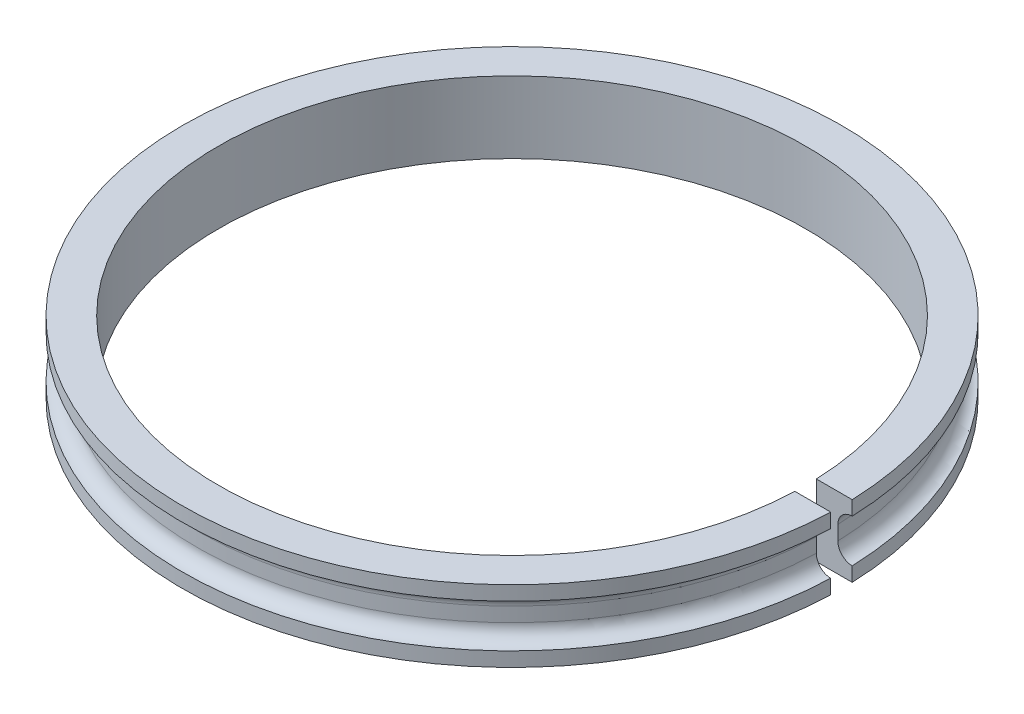
ISO-10303-21;
HEADER;
FILE_DESCRIPTION(('STEP AP214'),'2;1');
FILE_NAME('part.step','',(''),(''),'','','');
FILE_SCHEMA(('AUTOMOTIVE_DESIGN { 1 0 10303 214 1 1 1 1 }'));
ENDSEC;
DATA;
#1=APPLICATION_CONTEXT('core data for automotive mechanical design processes');
#2=APPLICATION_PROTOCOL_DEFINITION('international standard','automotive_design',2000,#1);
#3=PRODUCT_CONTEXT('',#1,'mechanical');
#4=PRODUCT('Part','Part','',(#3));
#5=PRODUCT_RELATED_PRODUCT_CATEGORY('part','',(#4));
#6=PRODUCT_DEFINITION_FORMATION('','',#4);
#7=PRODUCT_DEFINITION_CONTEXT('part definition',#1,'design');
#8=PRODUCT_DEFINITION('design','',#6,#7);
#9=PRODUCT_DEFINITION_SHAPE('','',#8);
#10=(LENGTH_UNIT() NAMED_UNIT(*) SI_UNIT(.MILLI.,.METRE.));
#11=(NAMED_UNIT(*) PLANE_ANGLE_UNIT() SI_UNIT($,.RADIAN.));
#12=(NAMED_UNIT(*) SI_UNIT($,.STERADIAN.) SOLID_ANGLE_UNIT());
#13=UNCERTAINTY_MEASURE_WITH_UNIT(LENGTH_MEASURE(1.E-05),#10,'distance_accuracy_value','');
#14=(GEOMETRIC_REPRESENTATION_CONTEXT(3) GLOBAL_UNCERTAINTY_ASSIGNED_CONTEXT((#13)) GLOBAL_UNIT_ASSIGNED_CONTEXT((#10,
#11,#12)) REPRESENTATION_CONTEXT('',''));
#15=CARTESIAN_POINT('',(0.,0.,0.));
#16=DIRECTION('',(0.,0.,1.));
#17=DIRECTION('',(1.,0.,0.));
#18=AXIS2_PLACEMENT_3D('',#15,#16,#17);
#19=CARTESIAN_POINT('',(-93.,4.,0.));
#20=DIRECTION('',(0.,-1.,0.));
#21=DIRECTION('',(0.,0.,-1.));
#22=AXIS2_PLACEMENT_3D('',#19,#20,#21);
#23=TOROIDAL_SURFACE('',#22,46.,2.);
#24=CARTESIAN_POINT('',(-93.,4.,0.));
#25=DIRECTION('',(0.,-1.,0.));
#26=DIRECTION('',(0.,0.,-1.));
#27=AXIS2_PLACEMENT_3D('',#24,#25,#26);
#28=CIRCLE('',#27,44.);
#29=CARTESIAN_POINT('',(-49.02557561491,4.,-1.5));
#30=VERTEX_POINT('',#29);
#31=CARTESIAN_POINT('',(-49.02557561491,4.,1.5));
#32=VERTEX_POINT('',#31);
#33=EDGE_CURVE('E99',#30,#32,#28,.F.);
#34=ORIENTED_EDGE('',*,*,#33,.F.);
#35=CARTESIAN_POINT('',(-49.02557561491,4.,-1.5));
#36=CARTESIAN_POINT('',(-49.0255752617127,3.9437526593681,-1.5));
#37=CARTESIAN_POINT('',(-49.0231999225664,3.88753227299927,-1.5));
#38=CARTESIAN_POINT('',(-49.0137238553494,3.77549401706613,-1.5));
#39=CARTESIAN_POINT('',(-49.0066233600378,3.71967612781189,-1.5));
#40=CARTESIAN_POINT('',(-48.9783030133706,3.55353055209689,-1.5));
#41=CARTESIAN_POINT('',(-48.9500641050258,3.44431603928843,-1.5));
#42=CARTESIAN_POINT('',(-48.8756541575683,3.23218215289164,-1.5));
#43=CARTESIAN_POINT('',(-48.8294747304092,3.12926575006156,-1.5));
#44=CARTESIAN_POINT('',(-48.720499819323,2.93264026134801,-1.5));
#45=CARTESIAN_POINT('',(-48.6577062064194,2.83893014031819,-1.5));
#46=CARTESIAN_POINT('',(-48.517264034677,2.66335009598695,-1.5));
#47=CARTESIAN_POINT('',(-48.4396106910103,2.58148400140877,-1.5));
#48=CARTESIAN_POINT('',(-48.2716695952436,2.43194079901288,-1.5));
#49=CARTESIAN_POINT('',(-48.1813818129104,2.36426372514936,-1.5));
#50=CARTESIAN_POINT('',(-47.990682603861,2.24498564534979,-1.5));
#51=CARTESIAN_POINT('',(-47.8902662781117,2.1933924687982,-1.5));
#52=CARTESIAN_POINT('',(-47.6822036521515,2.10778017983119,-1.5));
#53=CARTESIAN_POINT('',(-47.5745564793652,2.07376319272592,-1.5));
#54=CARTESIAN_POINT('',(-47.3550213612993,2.02427767687998,-1.5));
#55=CARTESIAN_POINT('',(-47.2431333830546,2.00880929235399,-1.5));
#56=CARTESIAN_POINT('',(-47.0746133491114,1.99983309304084,-1.5));
#57=CARTESIAN_POINT('',(-47.0182775601828,1.99921758557036,-1.5));
#58=CARTESIAN_POINT('',(-46.9057513613097,2.00273073005957,-1.5));
#59=CARTESIAN_POINT('',(-46.8495609583746,2.00685960663644,-1.5));
#60=CARTESIAN_POINT('',(-46.7936178312496,2.01335285538699,-1.5));
#61=B_SPLINE_CURVE_WITH_KNOTS('',3,(#35,#36,#37,#38,#39,#40,#41,#42,#43,#44,#45,#46,#47,#48,#49,
#50,#51,#52,#53,#54,#55,#56,#57,#58,#59,#60),.UNSPECIFIED.,.F.,.F.,(4,2,2,2,2,2,2,2,2,2,2,2,4),
(0.,0.168638346672592,0.337268386911073,0.67395115708494,1.01079153229287,1.34759399000942,
1.68450508103828,2.02141697828313,2.35849262369325,2.69560901870575,3.03272803476837,
3.20157236250897,3.37042468431165),.UNSPECIFIED.);
#62=CARTESIAN_POINT('',(-47.0244630265182,2.,-1.5));
#63=VERTEX_POINT('',#62);
#64=EDGE_CURVE('E45',#30,#63,#61,.T.);
#65=ORIENTED_EDGE('',*,*,#64,.T.);
#66=CARTESIAN_POINT('',(-93.,2.,0.));
#67=DIRECTION('',(0.,-1.,0.));
#68=DIRECTION('',(0.,0.,-1.));
#69=AXIS2_PLACEMENT_3D('',#66,#67,#68);
#70=CIRCLE('',#69,46.);
#71=CARTESIAN_POINT('',(-47.0244630265182,2.,1.5));
#72=VERTEX_POINT('',#71);
#73=EDGE_CURVE('E97',#72,#63,#70,.T.);
#74=ORIENTED_EDGE('',*,*,#73,.F.);
#75=CARTESIAN_POINT('',(-49.02557561491,4.,1.5));
#76=CARTESIAN_POINT('',(-49.0255752617127,3.9437526593681,1.5));
#77=CARTESIAN_POINT('',(-49.0231999225664,3.88753227299927,1.5));
#78=CARTESIAN_POINT('',(-49.0137238553494,3.77549401706613,1.5));
#79=CARTESIAN_POINT('',(-49.0066233600378,3.71967612781189,1.5));
#80=CARTESIAN_POINT('',(-48.9783030133706,3.55353055209689,1.5));
#81=CARTESIAN_POINT('',(-48.9500641050258,3.44431603928843,1.5));
#82=CARTESIAN_POINT('',(-48.8756541575683,3.23218215289164,1.5));
#83=CARTESIAN_POINT('',(-48.8294747304092,3.12926575006156,1.5));
#84=CARTESIAN_POINT('',(-48.720499819323,2.93264026134801,1.5));
#85=CARTESIAN_POINT('',(-48.6577062064194,2.83893014031819,1.5));
#86=CARTESIAN_POINT('',(-48.517264034677,2.66335009598695,1.5));
#87=CARTESIAN_POINT('',(-48.4396106910103,2.58148400140877,1.5));
#88=CARTESIAN_POINT('',(-48.2716695952436,2.43194079901288,1.5));
#89=CARTESIAN_POINT('',(-48.1813818129104,2.36426372514936,1.5));
#90=CARTESIAN_POINT('',(-47.990682603861,2.24498564534979,1.5));
#91=CARTESIAN_POINT('',(-47.8902662781117,2.1933924687982,1.5));
#92=CARTESIAN_POINT('',(-47.6822036521515,2.10778017983119,1.5));
#93=CARTESIAN_POINT('',(-47.5745564793652,2.07376319272592,1.5));
#94=CARTESIAN_POINT('',(-47.3550213612993,2.02427767687998,1.5));
#95=CARTESIAN_POINT('',(-47.2431333830546,2.00880929235399,1.5));
#96=CARTESIAN_POINT('',(-47.0746133491114,1.99983309304084,1.5));
#97=CARTESIAN_POINT('',(-47.0182775601828,1.99921758557036,1.5));
#98=CARTESIAN_POINT('',(-46.9057513613097,2.00273073005957,1.5));
#99=CARTESIAN_POINT('',(-46.8495609583746,2.00685960663644,1.5));
#100=CARTESIAN_POINT('',(-46.7936178312496,2.01335285538699,1.5));
#101=B_SPLINE_CURVE_WITH_KNOTS('',3,(#75,#76,#77,#78,#79,#80,#81,#82,#83,#84,#85,#86,#87,#88,
#89,#90,#91,#92,#93,#94,#95,#96,#97,#98,#99,#100),.UNSPECIFIED.,.F.,.F.,(4,2,2,2,2,2,2,2,2,2,2,
2,4),(0.,0.168638346672592,0.337268386911073,0.67395115708494,1.01079153229287,1.34759399000942,
1.68450508103828,2.02141697828313,2.35849262369325,2.69560901870575,3.03272803476837,
3.20157236250897,3.37042468431165),.UNSPECIFIED.);
#102=EDGE_CURVE('E11',#72,#32,#101,.F.);
#103=ORIENTED_EDGE('',*,*,#102,.T.);
#104=EDGE_LOOP('',(#34,#65,#74,#103));
#105=FACE_BOUND('',#104,.T.);
#106=ADVANCED_FACE('F33',(#105),#23,.F.);
#107=CARTESIAN_POINT('',(-93.,6.,0.));
#108=DIRECTION('',(0.,-1.,0.));
#109=DIRECTION('',(0.,0.,-1.));
#110=AXIS2_PLACEMENT_3D('',#107,#108,#109);
#111=TOROIDAL_SURFACE('',#110,46.,2.);
#112=CARTESIAN_POINT('',(-93.,8.,0.));
#113=DIRECTION('',(0.,-1.,0.));
#114=DIRECTION('',(0.,0.,-1.));
#115=AXIS2_PLACEMENT_3D('',#112,#113,#114);
#116=CIRCLE('',#115,46.);
#117=CARTESIAN_POINT('',(-47.0244630265182,8.,1.5));
#118=VERTEX_POINT('',#117);
#119=CARTESIAN_POINT('',(-47.0244630265182,8.,-1.5));
#120=VERTEX_POINT('',#119);
#121=EDGE_CURVE('E108',#118,#120,#116,.T.);
#122=ORIENTED_EDGE('',*,*,#121,.T.);
#123=CARTESIAN_POINT('',(-49.02557561491,6.,-1.5));
#124=CARTESIAN_POINT('',(-49.0255752617127,6.0562473406319,-1.5));
#125=CARTESIAN_POINT('',(-49.0231999225664,6.11246772700074,-1.5));
#126=CARTESIAN_POINT('',(-49.0137238553494,6.22450598293387,-1.5));
#127=CARTESIAN_POINT('',(-49.0066233600378,6.28032387218811,-1.5));
#128=CARTESIAN_POINT('',(-48.9783030133706,6.44646944790311,-1.5));
#129=CARTESIAN_POINT('',(-48.9500641050258,6.55568396071157,-1.5));
#130=CARTESIAN_POINT('',(-48.8756541575683,6.76781784710836,-1.5));
#131=CARTESIAN_POINT('',(-48.8294747304092,6.87073424993844,-1.5));
#132=CARTESIAN_POINT('',(-48.720499819323,7.06735973865199,-1.5));
#133=CARTESIAN_POINT('',(-48.6577062064194,7.16106985968181,-1.5));
#134=CARTESIAN_POINT('',(-48.517264034677,7.33664990401305,-1.5));
#135=CARTESIAN_POINT('',(-48.4396106910103,7.41851599859123,-1.5));
#136=CARTESIAN_POINT('',(-48.2716695952436,7.56805920098712,-1.5));
#137=CARTESIAN_POINT('',(-48.1813818129104,7.63573627485064,-1.5));
#138=CARTESIAN_POINT('',(-47.990682603861,7.75501435465021,-1.5));
#139=CARTESIAN_POINT('',(-47.8902662781117,7.8066075312018,-1.5));
#140=CARTESIAN_POINT('',(-47.6822036521515,7.89221982016881,-1.5));
#141=CARTESIAN_POINT('',(-47.5745564793652,7.92623680727408,-1.5));
#142=CARTESIAN_POINT('',(-47.3550213612993,7.97572232312002,-1.5));
#143=CARTESIAN_POINT('',(-47.2431333830546,7.99119070764601,-1.5));
#144=CARTESIAN_POINT('',(-47.0746133491114,8.00016690695917,-1.5));
#145=CARTESIAN_POINT('',(-47.0182775601828,8.00078241442964,-1.5));
#146=CARTESIAN_POINT('',(-46.9057513613097,7.99726926994043,-1.5));
#147=CARTESIAN_POINT('',(-46.8495609583746,7.99314039336356,-1.5));
#148=CARTESIAN_POINT('',(-46.7936178312496,7.98664714461301,-1.5));
#149=B_SPLINE_CURVE_WITH_KNOTS('',3,(#123,#124,#125,#126,#127,#128,#129,#130,#131,#132,#133,
#134,#135,#136,#137,#138,#139,#140,#141,#142,#143,#144,#145,#146,#147,#148),.UNSPECIFIED.,.F.,
.F.,(4,2,2,2,2,2,2,2,2,2,2,2,4),(0.,0.168638346672593,0.337268386911073,0.67395115708494,
1.01079153229287,1.34759399000941,1.68450508103828,2.02141697828313,2.35849262369325,
2.69560901870575,3.03272803476837,3.20157236250897,3.37042468431165),.UNSPECIFIED.);
#150=CARTESIAN_POINT('',(-49.02557561491,6.,-1.5));
#151=VERTEX_POINT('',#150);
#152=EDGE_CURVE('E142',#120,#151,#149,.F.);
#153=ORIENTED_EDGE('',*,*,#152,.T.);
#154=CARTESIAN_POINT('',(-93.,6.,0.));
#155=DIRECTION('',(0.,-1.,0.));
#156=DIRECTION('',(0.,0.,-1.));
#157=AXIS2_PLACEMENT_3D('',#154,#155,#156);
#158=CIRCLE('',#157,44.);
#159=CARTESIAN_POINT('',(-49.02557561491,6.,1.5));
#160=VERTEX_POINT('',#159);
#161=EDGE_CURVE('E139',#160,#151,#158,.T.);
#162=ORIENTED_EDGE('',*,*,#161,.F.);
#163=CARTESIAN_POINT('',(-47.0244630265182,8.,1.5));
#164=CARTESIAN_POINT('',(-47.0807873093381,7.99999961250028,1.5));
#165=CARTESIAN_POINT('',(-47.1370846127367,7.99762172312208,1.5));
#166=CARTESIAN_POINT('',(-47.249276480401,7.98813530808788,1.5));
#167=CARTESIAN_POINT('',(-47.3051710635456,7.98102700566522,1.5));
#168=CARTESIAN_POINT('',(-47.4715489020133,7.95267450445812,1.5));
#169=CARTESIAN_POINT('',(-47.5809179635325,7.92440252071446,1.5));
#170=CARTESIAN_POINT('',(-47.793354057642,7.84989915621452,1.5));
#171=CARTESIAN_POINT('',(-47.8964180512628,7.80365919281775,1.5));
#172=CARTESIAN_POINT('',(-48.0933207906504,7.6945313795319,1.5));
#173=CARTESIAN_POINT('',(-48.1871606463517,7.63164553600189,1.5));
#174=CARTESIAN_POINT('',(-48.3629272878691,7.49101791229881,1.5));
#175=CARTESIAN_POINT('',(-48.444855975276,7.41327850805898,1.5));
#176=CARTESIAN_POINT('',(-48.594492055469,7.24514294427632,1.5));
#177=CARTESIAN_POINT('',(-48.6621994813467,7.15474681418537,1.5));
#178=CARTESIAN_POINT('',(-48.7814279666101,6.96391442222868,1.5));
#179=CARTESIAN_POINT('',(-48.832958371446,6.86348400153718,1.5));
#180=CARTESIAN_POINT('',(-48.9184242077933,6.65539809307321,1.5));
#181=CARTESIAN_POINT('',(-48.9523576606363,6.54774179433194,1.5));
#182=CARTESIAN_POINT('',(-49.0016250843505,6.32830947506348,1.5));
#183=CARTESIAN_POINT('',(-49.0169775597432,6.21653766763981,1.5));
#184=CARTESIAN_POINT('',(-49.0257888564736,6.04820427198995,1.5));
#185=CARTESIAN_POINT('',(-49.0263507849234,5.99193227214987,1.5));
#186=CARTESIAN_POINT('',(-49.0227337242559,5.87953801074739,1.5));
#187=CARTESIAN_POINT('',(-49.0185545024,5.82341575667144,1.5));
#188=CARTESIAN_POINT('',(-49.0120127353524,5.76754300287763,1.5));
#189=B_SPLINE_CURVE_WITH_KNOTS('',3,(#163,#164,#165,#166,#167,#168,#169,#170,#171,#172,#173,
#174,#175,#176,#177,#178,#179,#180,#181,#182,#183,#184,#185,#186,#187,#188),.UNSPECIFIED.,.F.,
.F.,(4,2,2,2,2,2,2,2,2,2,2,2,4),(0.,0.168869077454674,0.337730186359345,0.674884571641019,
1.01220020148368,1.34947519254124,1.68669627914934,2.0239165810655,2.36094171109226,
2.69800472929741,3.03473179446849,3.2033830818738,3.37204264856947),.UNSPECIFIED.);
#190=EDGE_CURVE('E149',#160,#118,#189,.F.);
#191=ORIENTED_EDGE('',*,*,#190,.T.);
#192=EDGE_LOOP('',(#122,#153,#162,#191));
#193=FACE_BOUND('',#192,.T.);
#194=ADVANCED_FACE('F154',(#193),#111,.F.);
#195=CARTESIAN_POINT('',(-93.,10.,0.));
#196=DIRECTION('',(0.,-1.,0.));
#197=DIRECTION('',(0.,0.,-1.));
#198=AXIS2_PLACEMENT_3D('',#195,#196,#197);
#199=CYLINDRICAL_SURFACE('',#198,46.);
#200=ORIENTED_EDGE('',*,*,#121,.F.);
#201=DIRECTION('',(0.,-1.,0.));
#202=VECTOR('',#201,1.);
#203=CARTESIAN_POINT('',(-47.0244630265182,10.,1.5));
#204=LINE('',#203,#202);
#205=CARTESIAN_POINT('',(-47.0244630265182,10.,1.5));
#206=VERTEX_POINT('',#205);
#207=EDGE_CURVE('E120',#206,#118,#204,.T.);
#208=ORIENTED_EDGE('',*,*,#207,.F.);
#209=CARTESIAN_POINT('',(-93.,10.,0.));
#210=DIRECTION('',(0.,1.,0.));
#211=DIRECTION('',(0.,0.,1.));
#212=AXIS2_PLACEMENT_3D('',#209,#210,#211);
#213=CIRCLE('',#212,46.);
#214=CARTESIAN_POINT('',(-47.0244630265182,10.,-1.5));
#215=VERTEX_POINT('',#214);
#216=EDGE_CURVE('E127',#215,#206,#213,.T.);
#217=ORIENTED_EDGE('',*,*,#216,.F.);
#218=DIRECTION('',(0.,-1.,0.));
#219=VECTOR('',#218,1.);
#220=CARTESIAN_POINT('',(-47.0244630265182,10.,-1.5));
#221=LINE('',#220,#219);
#222=EDGE_CURVE('E115',#120,#215,#221,.F.);
#223=ORIENTED_EDGE('',*,*,#222,.F.);
#224=EDGE_LOOP('',(#200,#208,#217,#223));
#225=FACE_BOUND('',#224,.T.);
#226=ADVANCED_FACE('F182',(#225),#199,.T.);
#227=CARTESIAN_POINT('',(-57.8530362581809,10.,1.5));
#228=DIRECTION('',(0.,0.,-1.));
#229=DIRECTION('',(-1.,0.,0.));
#230=AXIS2_PLACEMENT_3D('',#227,#228,#229);
#231=PLANE('',#230);
#232=ORIENTED_EDGE('',*,*,#190,.F.);
#233=DIRECTION('',(0.,-1.,0.));
#234=VECTOR('',#233,1.);
#235=CARTESIAN_POINT('',(-49.02557561491,8.,1.5));
#236=LINE('',#235,#234);
#237=EDGE_CURVE('E109',#160,#32,#236,.T.);
#238=ORIENTED_EDGE('',*,*,#237,.T.);
#239=ORIENTED_EDGE('',*,*,#102,.F.);
#240=CARTESIAN_POINT('',(-47.0244630265182,0.,1.5));
#241=VERTEX_POINT('',#240);
#242=EDGE_CURVE('E107',#72,#241,#204,.T.);
#243=ORIENTED_EDGE('',*,*,#242,.T.);
#244=DIRECTION('',(1.,0.,0.));
#245=VECTOR('',#244,1.);
#246=CARTESIAN_POINT('',(-57.8530362581809,0.,1.5));
#247=LINE('',#246,#245);
#248=CARTESIAN_POINT('',(-52.0274482122483,0.,1.5));
#249=VERTEX_POINT('',#248);
#250=EDGE_CURVE('E190',#249,#241,#247,.T.);
#251=ORIENTED_EDGE('',*,*,#250,.F.);
#252=DIRECTION('',(0.,-1.,0.));
#253=VECTOR('',#252,1.);
#254=CARTESIAN_POINT('',(-52.0274482122483,10.,1.5));
#255=LINE('',#254,#253);
#256=CARTESIAN_POINT('',(-52.0274482122483,10.,1.5));
#257=VERTEX_POINT('',#256);
#258=EDGE_CURVE('E130',#257,#249,#255,.T.);
#259=ORIENTED_EDGE('',*,*,#258,.F.);
#260=DIRECTION('',(1.,0.,0.));
#261=VECTOR('',#260,1.);
#262=CARTESIAN_POINT('',(-57.8530362581809,10.,1.5));
#263=LINE('',#262,#261);
#264=EDGE_CURVE('E186',#257,#206,#263,.T.);
#265=ORIENTED_EDGE('',*,*,#264,.T.);
#266=ORIENTED_EDGE('',*,*,#207,.T.);
#267=EDGE_LOOP('',(#232,#238,#239,#243,#251,#259,#265,#266));
#268=FACE_BOUND('',#267,.T.);
#269=ADVANCED_FACE('F161',(#268),#231,.T.);
#270=CARTESIAN_POINT('',(-57.8530362581809,10.,-1.5));
#271=DIRECTION('',(0.,0.,1.));
#272=DIRECTION('',(1.,0.,0.));
#273=AXIS2_PLACEMENT_3D('',#270,#271,#272);
#274=PLANE('',#273);
#275=ORIENTED_EDGE('',*,*,#64,.F.);
#276=DIRECTION('',(0.,-1.,0.));
#277=VECTOR('',#276,1.);
#278=CARTESIAN_POINT('',(-49.02557561491,8.,-1.5));
#279=LINE('',#278,#277);
#280=EDGE_CURVE('E137',#30,#151,#279,.F.);
#281=ORIENTED_EDGE('',*,*,#280,.T.);
#282=ORIENTED_EDGE('',*,*,#152,.F.);
#283=ORIENTED_EDGE('',*,*,#222,.T.);
#284=DIRECTION('',(-1.,0.,0.));
#285=VECTOR('',#284,1.);
#286=CARTESIAN_POINT('',(-57.8530362581809,10.,-1.5));
#287=LINE('',#286,#285);
#288=CARTESIAN_POINT('',(-52.0274482122483,10.,-1.5));
#289=VERTEX_POINT('',#288);
#290=EDGE_CURVE('E188',#215,#289,#287,.T.);
#291=ORIENTED_EDGE('',*,*,#290,.T.);
#292=DIRECTION('',(0.,-1.,0.));
#293=VECTOR('',#292,1.);
#294=CARTESIAN_POINT('',(-52.0274482122483,10.,-1.5));
#295=LINE('',#294,#293);
#296=CARTESIAN_POINT('',(-52.0274482122483,0.,-1.5));
#297=VERTEX_POINT('',#296);
#298=EDGE_CURVE('E134',#297,#289,#295,.F.);
#299=ORIENTED_EDGE('',*,*,#298,.F.);
#300=DIRECTION('',(-1.,0.,0.));
#301=VECTOR('',#300,1.);
#302=CARTESIAN_POINT('',(-57.8530362581809,0.,-1.5));
#303=LINE('',#302,#301);
#304=CARTESIAN_POINT('',(-47.0244630265182,0.,-1.5));
#305=VERTEX_POINT('',#304);
#306=EDGE_CURVE('E113',#305,#297,#303,.T.);
#307=ORIENTED_EDGE('',*,*,#306,.F.);
#308=EDGE_CURVE('E105',#305,#63,#221,.F.);
#309=ORIENTED_EDGE('',*,*,#308,.T.);
#310=EDGE_LOOP('',(#275,#281,#282,#283,#291,#299,#307,#309));
#311=FACE_BOUND('',#310,.T.);
#312=ADVANCED_FACE('F111',(#311),#274,.T.);
#313=CARTESIAN_POINT('',(-93.,10.,0.));
#314=DIRECTION('',(0.,1.,0.));
#315=DIRECTION('',(0.,0.,1.));
#316=AXIS2_PLACEMENT_3D('',#313,#314,#315);
#317=PLANE('',#316);
#318=CARTESIAN_POINT('',(-93.,10.,0.));
#319=DIRECTION('',(0.,1.,0.));
#320=DIRECTION('',(0.,0.,1.));
#321=AXIS2_PLACEMENT_3D('',#318,#319,#320);
#322=CIRCLE('',#321,41.);
#323=EDGE_CURVE('E118',#289,#257,#322,.T.);
#324=ORIENTED_EDGE('',*,*,#323,.F.);
#325=ORIENTED_EDGE('',*,*,#290,.F.);
#326=ORIENTED_EDGE('',*,*,#216,.T.);
#327=ORIENTED_EDGE('',*,*,#264,.F.);
#328=EDGE_LOOP('',(#324,#325,#326,#327));
#329=FACE_BOUND('',#328,.T.);
#330=ADVANCED_FACE('F160',(#329),#317,.T.);
#331=CARTESIAN_POINT('',(-93.,0.,0.));
#332=DIRECTION('',(0.,1.,0.));
#333=DIRECTION('',(0.,0.,1.));
#334=AXIS2_PLACEMENT_3D('',#331,#332,#333);
#335=PLANE('',#334);
#336=ORIENTED_EDGE('',*,*,#306,.T.);
#337=CARTESIAN_POINT('',(-93.,0.,0.));
#338=DIRECTION('',(0.,1.,0.));
#339=DIRECTION('',(0.,0.,1.));
#340=AXIS2_PLACEMENT_3D('',#337,#338,#339);
#341=CIRCLE('',#340,41.);
#342=EDGE_CURVE('E114',#297,#249,#341,.T.);
#343=ORIENTED_EDGE('',*,*,#342,.T.);
#344=ORIENTED_EDGE('',*,*,#250,.T.);
#345=CARTESIAN_POINT('',(-93.,0.,0.));
#346=DIRECTION('',(0.,1.,0.));
#347=DIRECTION('',(0.,0.,1.));
#348=AXIS2_PLACEMENT_3D('',#345,#346,#347);
#349=CIRCLE('',#348,46.);
#350=EDGE_CURVE('E125',#305,#241,#349,.T.);
#351=ORIENTED_EDGE('',*,*,#350,.F.);
#352=EDGE_LOOP('',(#336,#343,#344,#351));
#353=FACE_BOUND('',#352,.T.);
#354=ADVANCED_FACE('F194',(#353),#335,.F.);
#355=ORIENTED_EDGE('',*,*,#242,.F.);
#356=ORIENTED_EDGE('',*,*,#73,.T.);
#357=ORIENTED_EDGE('',*,*,#308,.F.);
#358=ORIENTED_EDGE('',*,*,#350,.T.);
#359=EDGE_LOOP('',(#355,#356,#357,#358));
#360=FACE_BOUND('',#359,.T.);
#361=ADVANCED_FACE('F103',(#360),#199,.T.);
#362=CARTESIAN_POINT('',(-93.,10.,0.));
#363=DIRECTION('',(0.,-1.,0.));
#364=DIRECTION('',(0.,0.,-1.));
#365=AXIS2_PLACEMENT_3D('',#362,#363,#364);
#366=CYLINDRICAL_SURFACE('',#365,41.);
#367=ORIENTED_EDGE('',*,*,#342,.F.);
#368=ORIENTED_EDGE('',*,*,#298,.T.);
#369=ORIENTED_EDGE('',*,*,#323,.T.);
#370=ORIENTED_EDGE('',*,*,#258,.T.);
#371=EDGE_LOOP('',(#367,#368,#369,#370));
#372=FACE_BOUND('',#371,.T.);
#373=ADVANCED_FACE('F164',(#372),#366,.F.);
#374=CARTESIAN_POINT('',(-93.,8.,0.));
#375=DIRECTION('',(0.,-1.,0.));
#376=DIRECTION('',(0.,0.,-1.));
#377=AXIS2_PLACEMENT_3D('',#374,#375,#376);
#378=CYLINDRICAL_SURFACE('',#377,44.);
#379=ORIENTED_EDGE('',*,*,#280,.F.);
#380=ORIENTED_EDGE('',*,*,#33,.T.);
#381=ORIENTED_EDGE('',*,*,#237,.F.);
#382=ORIENTED_EDGE('',*,*,#161,.T.);
#383=EDGE_LOOP('',(#379,#380,#381,#382));
#384=FACE_BOUND('',#383,.T.);
#385=ADVANCED_FACE('F200',(#384),#378,.T.);
#386=CLOSED_SHELL('',(#106,#194,#226,#269,#312,#330,#354,#361,#373,#385));
#387=MANIFOLD_SOLID_BREP('B2',#386);
#388=ADVANCED_BREP_SHAPE_REPRESENTATION('',(#18,#387),#14);
#389=SHAPE_DEFINITION_REPRESENTATION(#9,#388);
ENDSEC;
END-ISO-10303-21;
